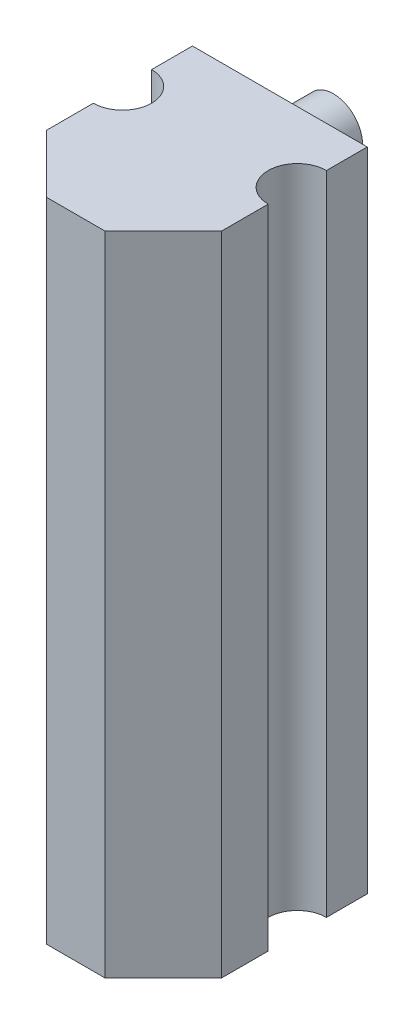
ISO-10303-21;
HEADER;
FILE_DESCRIPTION(('STEP AP214'),'2;1');
FILE_NAME('part.step','',(''),(''),'','','');
FILE_SCHEMA(('AUTOMOTIVE_DESIGN { 1 0 10303 214 1 1 1 1 }'));
ENDSEC;
DATA;
#1=APPLICATION_CONTEXT('core data for automotive mechanical design processes');
#2=APPLICATION_PROTOCOL_DEFINITION('international standard','automotive_design',2000,#1);
#3=PRODUCT_CONTEXT('',#1,'mechanical');
#4=PRODUCT('Part','Part','',(#3));
#5=PRODUCT_RELATED_PRODUCT_CATEGORY('part','',(#4));
#6=PRODUCT_DEFINITION_FORMATION('','',#4);
#7=PRODUCT_DEFINITION_CONTEXT('part definition',#1,'design');
#8=PRODUCT_DEFINITION('design','',#6,#7);
#9=PRODUCT_DEFINITION_SHAPE('','',#8);
#10=(LENGTH_UNIT() NAMED_UNIT(*) SI_UNIT(.MILLI.,.METRE.));
#11=(NAMED_UNIT(*) PLANE_ANGLE_UNIT() SI_UNIT($,.RADIAN.));
#12=(NAMED_UNIT(*) SI_UNIT($,.STERADIAN.) SOLID_ANGLE_UNIT());
#13=UNCERTAINTY_MEASURE_WITH_UNIT(LENGTH_MEASURE(1.E-05),#10,'distance_accuracy_value','');
#14=(GEOMETRIC_REPRESENTATION_CONTEXT(3) GLOBAL_UNCERTAINTY_ASSIGNED_CONTEXT((#13)) GLOBAL_UNIT_ASSIGNED_CONTEXT((#10,
#11,#12)) REPRESENTATION_CONTEXT('',''));
#15=CARTESIAN_POINT('',(0.,0.,0.));
#16=DIRECTION('',(0.,0.,1.));
#17=DIRECTION('',(1.,0.,0.));
#18=AXIS2_PLACEMENT_3D('',#15,#16,#17);
#19=CARTESIAN_POINT('',(-14.189148368737,55.5,35.));
#20=DIRECTION('',(1.,0.,0.));
#21=DIRECTION('',(0.,1.,0.));
#22=AXIS2_PLACEMENT_3D('',#19,#20,#21);
#23=PLANE('',#22);
#24=DIRECTION('',(0.,0.,-1.));
#25=VECTOR('',#24,1.);
#26=CARTESIAN_POINT('',(-14.189148368737,-55.5,35.));
#27=LINE('',#26,#25);
#28=CARTESIAN_POINT('',(-14.189148368737,-55.5,7.));
#29=VERTEX_POINT('',#28);
#30=CARTESIAN_POINT('',(-14.189148368737,-55.5,0.));
#31=VERTEX_POINT('',#30);
#32=EDGE_CURVE('E122',#29,#31,#27,.T.);
#33=ORIENTED_EDGE('',*,*,#32,.F.);
#34=DIRECTION('',(0.,1.,0.));
#35=VECTOR('',#34,1.);
#36=CARTESIAN_POINT('',(-14.189148368737,-55.5,7.));
#37=LINE('',#36,#35);
#38=CARTESIAN_POINT('',(-14.189148368737,55.5,7.));
#39=VERTEX_POINT('',#38);
#40=EDGE_CURVE('E108',#29,#39,#37,.T.);
#41=ORIENTED_EDGE('',*,*,#40,.T.);
#42=DIRECTION('',(0.,0.,-1.));
#43=VECTOR('',#42,1.);
#44=CARTESIAN_POINT('',(-14.189148368737,55.5,35.));
#45=LINE('',#44,#43);
#46=CARTESIAN_POINT('',(-14.189148368737,55.5,0.));
#47=VERTEX_POINT('',#46);
#48=EDGE_CURVE('E169',#39,#47,#45,.T.);
#49=ORIENTED_EDGE('',*,*,#48,.T.);
#50=DIRECTION('',(0.,-1.,0.));
#51=VECTOR('',#50,1.);
#52=CARTESIAN_POINT('',(-14.189148368737,55.5,0.));
#53=LINE('',#52,#51);
#54=EDGE_CURVE('E130',#47,#31,#53,.T.);
#55=ORIENTED_EDGE('',*,*,#54,.T.);
#56=EDGE_LOOP('',(#33,#41,#49,#55));
#57=FACE_BOUND('',#56,.T.);
#58=ADVANCED_FACE('F33',(#57),#23,.F.);
#59=CARTESIAN_POINT('',(15.810851631263,55.5,35.));
#60=DIRECTION('',(-1.,0.,0.));
#61=DIRECTION('',(0.,-1.,0.));
#62=AXIS2_PLACEMENT_3D('',#59,#60,#61);
#63=PLANE('',#62);
#64=DIRECTION('',(0.,0.,-1.));
#65=VECTOR('',#64,1.);
#66=CARTESIAN_POINT('',(15.810851631263,-55.5,35.));
#67=LINE('',#66,#65);
#68=CARTESIAN_POINT('',(15.810851631263,-55.5,25.));
#69=VERTEX_POINT('',#68);
#70=CARTESIAN_POINT('',(15.810851631263,-55.5,17.));
#71=VERTEX_POINT('',#70);
#72=EDGE_CURVE('E131',#69,#71,#67,.T.);
#73=ORIENTED_EDGE('',*,*,#72,.T.);
#74=DIRECTION('',(0.,1.,0.));
#75=VECTOR('',#74,1.);
#76=CARTESIAN_POINT('',(15.810851631263,-55.5,17.));
#77=LINE('',#76,#75);
#78=CARTESIAN_POINT('',(15.810851631263,55.5,17.));
#79=VERTEX_POINT('',#78);
#80=EDGE_CURVE('E204',#71,#79,#77,.T.);
#81=ORIENTED_EDGE('',*,*,#80,.T.);
#82=DIRECTION('',(0.,0.,-1.));
#83=VECTOR('',#82,1.);
#84=CARTESIAN_POINT('',(15.810851631263,55.5,35.));
#85=LINE('',#84,#83);
#86=CARTESIAN_POINT('',(15.810851631263,55.5,25.));
#87=VERTEX_POINT('',#86);
#88=EDGE_CURVE('E172',#87,#79,#85,.T.);
#89=ORIENTED_EDGE('',*,*,#88,.F.);
#90=DIRECTION('',(0.,1.,0.));
#91=VECTOR('',#90,1.);
#92=CARTESIAN_POINT('',(15.810851631263,-55.5,25.));
#93=LINE('',#92,#91);
#94=EDGE_CURVE('E159',#69,#87,#93,.T.);
#95=ORIENTED_EDGE('',*,*,#94,.F.);
#96=EDGE_LOOP('',(#73,#81,#89,#95));
#97=FACE_BOUND('',#96,.T.);
#98=ADVANCED_FACE('F221',(#97),#63,.F.);
#99=CARTESIAN_POINT('',(-14.189148368737,-55.5,25.));
#100=VERTEX_POINT('',#99);
#101=CARTESIAN_POINT('',(-14.189148368737,-55.5,17.));
#102=VERTEX_POINT('',#101);
#103=EDGE_CURVE('E126',#100,#102,#27,.T.);
#104=ORIENTED_EDGE('',*,*,#103,.F.);
#105=DIRECTION('',(0.,1.,0.));
#106=VECTOR('',#105,1.);
#107=CARTESIAN_POINT('',(-14.189148368737,-55.5,25.));
#108=LINE('',#107,#106);
#109=CARTESIAN_POINT('',(-14.189148368737,55.5,25.));
#110=VERTEX_POINT('',#109);
#111=EDGE_CURVE('E180',#100,#110,#108,.T.);
#112=ORIENTED_EDGE('',*,*,#111,.T.);
#113=CARTESIAN_POINT('',(-14.189148368737,55.5,17.));
#114=VERTEX_POINT('',#113);
#115=EDGE_CURVE('E170',#110,#114,#45,.T.);
#116=ORIENTED_EDGE('',*,*,#115,.T.);
#117=DIRECTION('',(0.,1.,0.));
#118=VECTOR('',#117,1.);
#119=CARTESIAN_POINT('',(-14.189148368737,-55.5,17.));
#120=LINE('',#119,#118);
#121=EDGE_CURVE('E56',#102,#114,#120,.T.);
#122=ORIENTED_EDGE('',*,*,#121,.F.);
#123=EDGE_LOOP('',(#104,#112,#116,#122));
#124=FACE_BOUND('',#123,.T.);
#125=ADVANCED_FACE('F35',(#124),#23,.F.);
#126=CARTESIAN_POINT('',(-14.189148368737,-55.5,35.));
#127=DIRECTION('',(0.,1.,0.));
#128=DIRECTION('',(0.,0.,1.));
#129=AXIS2_PLACEMENT_3D('',#126,#127,#128);
#130=PLANE('',#129);
#131=DIRECTION('',(1.,0.,0.));
#132=VECTOR('',#131,1.);
#133=CARTESIAN_POINT('',(-14.189148368737,-55.5,35.));
#134=LINE('',#133,#132);
#135=CARTESIAN_POINT('',(-4.18914836873697,-55.5,35.));
#136=VERTEX_POINT('',#135);
#137=CARTESIAN_POINT('',(5.81085163126303,-55.5,35.));
#138=VERTEX_POINT('',#137);
#139=EDGE_CURVE('E168',#136,#138,#134,.T.);
#140=ORIENTED_EDGE('',*,*,#139,.F.);
#141=DIRECTION('',(-0.707106781186547,0.,-0.707106781186548));
#142=VECTOR('',#141,1.);
#143=CARTESIAN_POINT('',(-4.18914836873697,-55.5,35.));
#144=LINE('',#143,#142);
#145=EDGE_CURVE('E194',#136,#100,#144,.T.);
#146=ORIENTED_EDGE('',*,*,#145,.T.);
#147=ORIENTED_EDGE('',*,*,#103,.T.);
#148=CARTESIAN_POINT('',(-14.189148368737,-55.5,12.));
#149=DIRECTION('',(0.,1.,0.));
#150=DIRECTION('',(0.,0.,-1.));
#151=AXIS2_PLACEMENT_3D('',#148,#149,#150);
#152=CIRCLE('',#151,5.);
#153=EDGE_CURVE('E111',#102,#29,#152,.T.);
#154=ORIENTED_EDGE('',*,*,#153,.T.);
#155=ORIENTED_EDGE('',*,*,#32,.T.);
#156=DIRECTION('',(1.,0.,0.));
#157=VECTOR('',#156,1.);
#158=CARTESIAN_POINT('',(-14.189148368737,-55.5,0.));
#159=LINE('',#158,#157);
#160=CARTESIAN_POINT('',(15.810851631263,-55.5,0.));
#161=VERTEX_POINT('',#160);
#162=EDGE_CURVE('E153',#31,#161,#159,.T.);
#163=ORIENTED_EDGE('',*,*,#162,.T.);
#164=CARTESIAN_POINT('',(15.810851631263,-55.5,7.));
#165=VERTEX_POINT('',#164);
#166=EDGE_CURVE('E134',#165,#161,#67,.T.);
#167=ORIENTED_EDGE('',*,*,#166,.F.);
#168=CARTESIAN_POINT('',(15.810851631263,-55.5,12.));
#169=DIRECTION('',(0.,1.,0.));
#170=DIRECTION('',(0.,0.,1.));
#171=AXIS2_PLACEMENT_3D('',#168,#169,#170);
#172=CIRCLE('',#171,5.);
#173=EDGE_CURVE('E201',#165,#71,#172,.T.);
#174=ORIENTED_EDGE('',*,*,#173,.T.);
#175=ORIENTED_EDGE('',*,*,#72,.F.);
#176=DIRECTION('',(-0.707106781186547,0.,0.707106781186548));
#177=VECTOR('',#176,1.);
#178=CARTESIAN_POINT('',(5.81085163126303,-55.5,35.));
#179=LINE('',#178,#177);
#180=EDGE_CURVE('E209',#69,#138,#179,.T.);
#181=ORIENTED_EDGE('',*,*,#180,.T.);
#182=EDGE_LOOP('',(#140,#146,#147,#154,#155,#163,#167,#174,#175,#181));
#183=FACE_BOUND('',#182,.T.);
#184=ADVANCED_FACE('F120',(#183),#130,.F.);
#185=CARTESIAN_POINT('',(15.810851631263,55.5,7.));
#186=VERTEX_POINT('',#185);
#187=CARTESIAN_POINT('',(15.810851631263,55.5,0.));
#188=VERTEX_POINT('',#187);
#189=EDGE_CURVE('E171',#186,#188,#85,.T.);
#190=ORIENTED_EDGE('',*,*,#189,.F.);
#191=DIRECTION('',(0.,1.,0.));
#192=VECTOR('',#191,1.);
#193=CARTESIAN_POINT('',(15.810851631263,-55.5,7.));
#194=LINE('',#193,#192);
#195=EDGE_CURVE('E48',#165,#186,#194,.T.);
#196=ORIENTED_EDGE('',*,*,#195,.F.);
#197=ORIENTED_EDGE('',*,*,#166,.T.);
#198=DIRECTION('',(0.,1.,0.));
#199=VECTOR('',#198,1.);
#200=CARTESIAN_POINT('',(15.810851631263,55.5,0.));
#201=LINE('',#200,#199);
#202=EDGE_CURVE('E156',#161,#188,#201,.T.);
#203=ORIENTED_EDGE('',*,*,#202,.T.);
#204=EDGE_LOOP('',(#190,#196,#197,#203));
#205=FACE_BOUND('',#204,.T.);
#206=ADVANCED_FACE('F226',(#205),#63,.F.);
#207=CARTESIAN_POINT('',(-14.189148368737,55.5,35.));
#208=DIRECTION('',(0.,-1.,0.));
#209=DIRECTION('',(0.,0.,-1.));
#210=AXIS2_PLACEMENT_3D('',#207,#208,#209);
#211=PLANE('',#210);
#212=ORIENTED_EDGE('',*,*,#115,.F.);
#213=DIRECTION('',(-0.707106781186547,0.,-0.707106781186548));
#214=VECTOR('',#213,1.);
#215=CARTESIAN_POINT('',(-4.18914836873697,55.5,35.));
#216=LINE('',#215,#214);
#217=CARTESIAN_POINT('',(-4.18914836873697,55.5,35.));
#218=VERTEX_POINT('',#217);
#219=EDGE_CURVE('E184',#218,#110,#216,.T.);
#220=ORIENTED_EDGE('',*,*,#219,.F.);
#221=DIRECTION('',(-1.,0.,0.));
#222=VECTOR('',#221,1.);
#223=CARTESIAN_POINT('',(-14.189148368737,55.5,35.));
#224=LINE('',#223,#222);
#225=CARTESIAN_POINT('',(5.81085163126303,55.5,35.));
#226=VERTEX_POINT('',#225);
#227=EDGE_CURVE('E162',#226,#218,#224,.T.);
#228=ORIENTED_EDGE('',*,*,#227,.F.);
#229=DIRECTION('',(-0.707106781186547,0.,0.707106781186548));
#230=VECTOR('',#229,1.);
#231=CARTESIAN_POINT('',(5.81085163126303,55.5,35.));
#232=LINE('',#231,#230);
#233=EDGE_CURVE('E199',#87,#226,#232,.T.);
#234=ORIENTED_EDGE('',*,*,#233,.F.);
#235=ORIENTED_EDGE('',*,*,#88,.T.);
#236=CARTESIAN_POINT('',(15.810851631263,55.5,12.));
#237=DIRECTION('',(0.,1.,0.));
#238=DIRECTION('',(0.,0.,1.));
#239=AXIS2_PLACEMENT_3D('',#236,#237,#238);
#240=CIRCLE('',#239,5.);
#241=EDGE_CURVE('E192',#186,#79,#240,.T.);
#242=ORIENTED_EDGE('',*,*,#241,.F.);
#243=ORIENTED_EDGE('',*,*,#189,.T.);
#244=DIRECTION('',(-1.,0.,0.));
#245=VECTOR('',#244,1.);
#246=CARTESIAN_POINT('',(-14.189148368737,55.5,0.));
#247=LINE('',#246,#245);
#248=EDGE_CURVE('E152',#188,#47,#247,.T.);
#249=ORIENTED_EDGE('',*,*,#248,.T.);
#250=ORIENTED_EDGE('',*,*,#48,.F.);
#251=CARTESIAN_POINT('',(-14.189148368737,55.5,12.));
#252=DIRECTION('',(0.,1.,0.));
#253=DIRECTION('',(0.,0.,-1.));
#254=AXIS2_PLACEMENT_3D('',#251,#252,#253);
#255=CIRCLE('',#254,5.);
#256=EDGE_CURVE('E112',#114,#39,#255,.T.);
#257=ORIENTED_EDGE('',*,*,#256,.F.);
#258=EDGE_LOOP('',(#212,#220,#228,#234,#235,#242,#243,#249,#250,#257));
#259=FACE_BOUND('',#258,.T.);
#260=ADVANCED_FACE('F182',(#259),#211,.F.);
#261=CARTESIAN_POINT('',(0.,0.,35.));
#262=DIRECTION('',(0.,0.,1.));
#263=DIRECTION('',(1.,0.,0.));
#264=AXIS2_PLACEMENT_3D('',#261,#262,#263);
#265=PLANE('',#264);
#266=DIRECTION('',(0.,1.,0.));
#267=VECTOR('',#266,1.);
#268=CARTESIAN_POINT('',(-4.18914836873697,-55.5,35.));
#269=LINE('',#268,#267);
#270=EDGE_CURVE('E197',#136,#218,#269,.T.);
#271=ORIENTED_EDGE('',*,*,#270,.F.);
#272=ORIENTED_EDGE('',*,*,#139,.T.);
#273=DIRECTION('',(0.,1.,0.));
#274=VECTOR('',#273,1.);
#275=CARTESIAN_POINT('',(5.81085163126303,-55.5,35.));
#276=LINE('',#275,#274);
#277=EDGE_CURVE('E154',#138,#226,#276,.T.);
#278=ORIENTED_EDGE('',*,*,#277,.T.);
#279=ORIENTED_EDGE('',*,*,#227,.T.);
#280=EDGE_LOOP('',(#271,#272,#278,#279));
#281=FACE_BOUND('',#280,.T.);
#282=ADVANCED_FACE('F146',(#281),#265,.T.);
#283=CARTESIAN_POINT('',(0.,0.,0.));
#284=DIRECTION('',(0.,0.,1.));
#285=DIRECTION('',(1.,0.,0.));
#286=AXIS2_PLACEMENT_3D('',#283,#284,#285);
#287=PLANE('',#286);
#288=CARTESIAN_POINT('',(0.,-45.5,0.));
#289=DIRECTION('',(0.,0.,1.));
#290=DIRECTION('',(1.,0.,0.));
#291=AXIS2_PLACEMENT_3D('',#288,#289,#290);
#292=CIRCLE('',#291,5.);
#293=CARTESIAN_POINT('',(5.,-45.5,0.));
#294=VERTEX_POINT('',#293);
#295=EDGE_CURVE('E11',#294,#294,#292,.F.);
#296=ORIENTED_EDGE('',*,*,#295,.F.);
#297=EDGE_LOOP('',(#296));
#298=FACE_BOUND('',#297,.T.);
#299=CARTESIAN_POINT('',(0.,45.5,0.));
#300=DIRECTION('',(0.,0.,1.));
#301=DIRECTION('',(1.,0.,0.));
#302=AXIS2_PLACEMENT_3D('',#299,#300,#301);
#303=CIRCLE('',#302,5.);
#304=CARTESIAN_POINT('',(5.,45.5,0.));
#305=VERTEX_POINT('',#304);
#306=EDGE_CURVE('E41',#305,#305,#303,.F.);
#307=ORIENTED_EDGE('',*,*,#306,.F.);
#308=EDGE_LOOP('',(#307));
#309=FACE_BOUND('',#308,.T.);
#310=ORIENTED_EDGE('',*,*,#54,.F.);
#311=ORIENTED_EDGE('',*,*,#248,.F.);
#312=ORIENTED_EDGE('',*,*,#202,.F.);
#313=ORIENTED_EDGE('',*,*,#162,.F.);
#314=EDGE_LOOP('',(#310,#311,#312,#313));
#315=FACE_BOUND('',#314,.T.);
#316=ADVANCED_FACE('F142',(#298,#309,#315),#287,.F.);
#317=CARTESIAN_POINT('',(5.81085163126303,-55.5,35.));
#318=DIRECTION('',(-0.707106781186548,0.,-0.707106781186547));
#319=DIRECTION('',(-0.707106781186547,0.,0.707106781186548));
#320=AXIS2_PLACEMENT_3D('',#317,#318,#319);
#321=PLANE('',#320);
#322=ORIENTED_EDGE('',*,*,#233,.T.);
#323=ORIENTED_EDGE('',*,*,#277,.F.);
#324=ORIENTED_EDGE('',*,*,#180,.F.);
#325=ORIENTED_EDGE('',*,*,#94,.T.);
#326=EDGE_LOOP('',(#322,#323,#324,#325));
#327=FACE_BOUND('',#326,.T.);
#328=ADVANCED_FACE('F145',(#327),#321,.F.);
#329=CARTESIAN_POINT('',(-4.18914836873697,-55.5,35.));
#330=DIRECTION('',(0.707106781186548,0.,-0.707106781186547));
#331=DIRECTION('',(-0.707106781186547,0.,-0.707106781186548));
#332=AXIS2_PLACEMENT_3D('',#329,#330,#331);
#333=PLANE('',#332);
#334=ORIENTED_EDGE('',*,*,#219,.T.);
#335=ORIENTED_EDGE('',*,*,#111,.F.);
#336=ORIENTED_EDGE('',*,*,#145,.F.);
#337=ORIENTED_EDGE('',*,*,#270,.T.);
#338=EDGE_LOOP('',(#334,#335,#336,#337));
#339=FACE_BOUND('',#338,.T.);
#340=ADVANCED_FACE('F275',(#339),#333,.F.);
#341=CARTESIAN_POINT('',(-14.189148368737,-55.5,12.));
#342=DIRECTION('',(0.,1.,0.));
#343=DIRECTION('',(0.,0.,1.));
#344=AXIS2_PLACEMENT_3D('',#341,#342,#343);
#345=CYLINDRICAL_SURFACE('',#344,5.);
#346=ORIENTED_EDGE('',*,*,#256,.T.);
#347=ORIENTED_EDGE('',*,*,#40,.F.);
#348=ORIENTED_EDGE('',*,*,#153,.F.);
#349=ORIENTED_EDGE('',*,*,#121,.T.);
#350=EDGE_LOOP('',(#346,#347,#348,#349));
#351=FACE_BOUND('',#350,.T.);
#352=ADVANCED_FACE('F110',(#351),#345,.F.);
#353=CARTESIAN_POINT('',(15.810851631263,-55.5,12.));
#354=DIRECTION('',(0.,1.,0.));
#355=DIRECTION('',(0.,0.,1.));
#356=AXIS2_PLACEMENT_3D('',#353,#354,#355);
#357=CYLINDRICAL_SURFACE('',#356,5.);
#358=ORIENTED_EDGE('',*,*,#241,.T.);
#359=ORIENTED_EDGE('',*,*,#80,.F.);
#360=ORIENTED_EDGE('',*,*,#173,.F.);
#361=ORIENTED_EDGE('',*,*,#195,.T.);
#362=EDGE_LOOP('',(#358,#359,#360,#361));
#363=FACE_BOUND('',#362,.T.);
#364=ADVANCED_FACE('F223',(#363),#357,.F.);
#365=CARTESIAN_POINT('',(0.,45.5,-10.));
#366=DIRECTION('',(0.,0.,1.));
#367=DIRECTION('',(1.,0.,0.));
#368=AXIS2_PLACEMENT_3D('',#365,#366,#367);
#369=CYLINDRICAL_SURFACE('',#368,5.);
#370=CARTESIAN_POINT('',(0.,45.5,-10.));
#371=DIRECTION('',(0.,0.,-1.));
#372=DIRECTION('',(-1.,0.,0.));
#373=AXIS2_PLACEMENT_3D('',#370,#371,#372);
#374=CIRCLE('',#373,5.);
#375=CARTESIAN_POINT('',(-5.,45.5,-10.));
#376=VERTEX_POINT('',#375);
#377=EDGE_CURVE('E186',#376,#376,#374,.T.);
#378=ORIENTED_EDGE('',*,*,#377,.F.);
#379=EDGE_LOOP('',(#378));
#380=FACE_BOUND('',#379,.T.);
#381=ORIENTED_EDGE('',*,*,#306,.T.);
#382=EDGE_LOOP('',(#381));
#383=FACE_BOUND('',#382,.T.);
#384=ADVANCED_FACE('F140',(#380,#383),#369,.T.);
#385=CARTESIAN_POINT('',(0.,45.5,-10.));
#386=DIRECTION('',(0.,0.,-1.));
#387=DIRECTION('',(-1.,0.,0.));
#388=AXIS2_PLACEMENT_3D('',#385,#386,#387);
#389=PLANE('',#388);
#390=ORIENTED_EDGE('',*,*,#377,.T.);
#391=EDGE_LOOP('',(#390));
#392=FACE_BOUND('',#391,.T.);
#393=ADVANCED_FACE('F316',(#392),#389,.T.);
#394=CARTESIAN_POINT('',(0.,-45.5,-10.));
#395=DIRECTION('',(0.,0.,1.));
#396=DIRECTION('',(1.,0.,0.));
#397=AXIS2_PLACEMENT_3D('',#394,#395,#396);
#398=CYLINDRICAL_SURFACE('',#397,5.);
#399=CARTESIAN_POINT('',(0.,-45.5,-10.));
#400=DIRECTION('',(0.,0.,-1.));
#401=DIRECTION('',(-1.,0.,0.));
#402=AXIS2_PLACEMENT_3D('',#399,#400,#401);
#403=CIRCLE('',#402,5.);
#404=CARTESIAN_POINT('',(-5.,-45.5,-10.));
#405=VERTEX_POINT('',#404);
#406=EDGE_CURVE('E189',#405,#405,#403,.T.);
#407=ORIENTED_EDGE('',*,*,#406,.F.);
#408=EDGE_LOOP('',(#407));
#409=FACE_BOUND('',#408,.T.);
#410=ORIENTED_EDGE('',*,*,#295,.T.);
#411=EDGE_LOOP('',(#410));
#412=FACE_BOUND('',#411,.T.);
#413=ADVANCED_FACE('F326',(#409,#412),#398,.T.);
#414=CARTESIAN_POINT('',(0.,-45.5,-10.));
#415=DIRECTION('',(0.,0.,-1.));
#416=DIRECTION('',(-1.,0.,0.));
#417=AXIS2_PLACEMENT_3D('',#414,#415,#416);
#418=PLANE('',#417);
#419=ORIENTED_EDGE('',*,*,#406,.T.);
#420=EDGE_LOOP('',(#419));
#421=FACE_BOUND('',#420,.T.);
#422=ADVANCED_FACE('F336',(#421),#418,.T.);
#423=CLOSED_SHELL('',(#58,#98,#125,#184,#206,#260,#282,#316,#328,#340,#352,#364,#384,#393,#413,#422));
#424=MANIFOLD_SOLID_BREP('B2',#423);
#425=ADVANCED_BREP_SHAPE_REPRESENTATION('',(#18,#424),#14);
#426=SHAPE_DEFINITION_REPRESENTATION(#9,#425);
ENDSEC;
END-ISO-10303-21;
